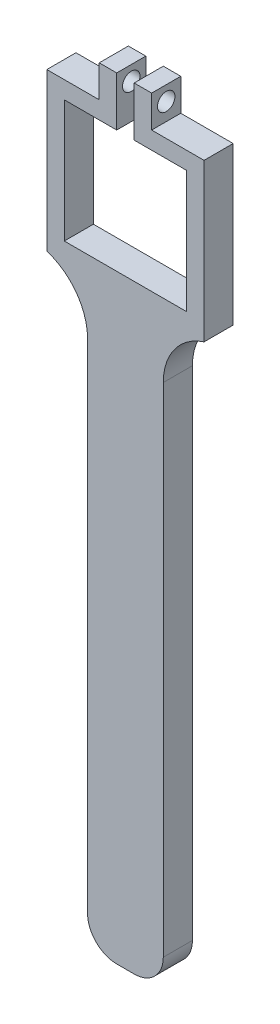
ISO-10303-21;
HEADER;
FILE_DESCRIPTION(('STEP AP214'),'2;1');
FILE_NAME('part.step','',(''),(''),'','','');
FILE_SCHEMA(('AUTOMOTIVE_DESIGN { 1 0 10303 214 1 1 1 1 }'));
ENDSEC;
DATA;
#1=APPLICATION_CONTEXT('core data for automotive mechanical design processes');
#2=APPLICATION_PROTOCOL_DEFINITION('international standard','automotive_design',2000,#1);
#3=PRODUCT_CONTEXT('',#1,'mechanical');
#4=PRODUCT('Part','Part','',(#3));
#5=PRODUCT_RELATED_PRODUCT_CATEGORY('part','',(#4));
#6=PRODUCT_DEFINITION_FORMATION('','',#4);
#7=PRODUCT_DEFINITION_CONTEXT('part definition',#1,'design');
#8=PRODUCT_DEFINITION('design','',#6,#7);
#9=PRODUCT_DEFINITION_SHAPE('','',#8);
#10=(LENGTH_UNIT() NAMED_UNIT(*) SI_UNIT(.MILLI.,.METRE.));
#11=(NAMED_UNIT(*) PLANE_ANGLE_UNIT() SI_UNIT($,.RADIAN.));
#12=(NAMED_UNIT(*) SI_UNIT($,.STERADIAN.) SOLID_ANGLE_UNIT());
#13=UNCERTAINTY_MEASURE_WITH_UNIT(LENGTH_MEASURE(1.E-05),#10,'distance_accuracy_value','');
#14=(GEOMETRIC_REPRESENTATION_CONTEXT(3) GLOBAL_UNCERTAINTY_ASSIGNED_CONTEXT((#13)) GLOBAL_UNIT_ASSIGNED_CONTEXT((#10,
#11,#12)) REPRESENTATION_CONTEXT('',''));
#15=CARTESIAN_POINT('',(0.,0.,0.));
#16=DIRECTION('',(0.,0.,1.));
#17=DIRECTION('',(1.,0.,0.));
#18=AXIS2_PLACEMENT_3D('',#15,#16,#17);
#19=CARTESIAN_POINT('',(-12.3188976377953,15.3425196850394,5.));
#20=DIRECTION('',(-1.,0.,0.));
#21=DIRECTION('',(0.,-1.,0.));
#22=AXIS2_PLACEMENT_3D('',#19,#20,#21);
#23=PLANE('',#22);
#24=DIRECTION('',(0.,1.,0.));
#25=VECTOR('',#24,1.);
#26=CARTESIAN_POINT('',(-12.3188976377953,15.3425196850394,0.));
#27=LINE('',#26,#25);
#28=CARTESIAN_POINT('',(-12.3188976377953,-5.65748031496064,0.));
#29=VERTEX_POINT('',#28);
#30=CARTESIAN_POINT('',(-12.3188976377953,15.3425196850394,0.));
#31=VERTEX_POINT('',#30);
#32=EDGE_CURVE('E209',#29,#31,#27,.T.);
#33=ORIENTED_EDGE('',*,*,#32,.T.);
#34=DIRECTION('',(0.,0.,-1.));
#35=VECTOR('',#34,1.);
#36=CARTESIAN_POINT('',(-12.3188976377953,15.3425196850394,5.));
#37=LINE('',#36,#35);
#38=CARTESIAN_POINT('',(-12.3188976377953,15.3425196850394,5.));
#39=VERTEX_POINT('',#38);
#40=EDGE_CURVE('E190',#39,#31,#37,.T.);
#41=ORIENTED_EDGE('',*,*,#40,.F.);
#42=DIRECTION('',(0.,1.,0.));
#43=VECTOR('',#42,1.);
#44=CARTESIAN_POINT('',(-12.3188976377953,15.3425196850394,5.));
#45=LINE('',#44,#43);
#46=CARTESIAN_POINT('',(-12.3188976377953,-5.65748031496064,5.));
#47=VERTEX_POINT('',#46);
#48=EDGE_CURVE('E197',#47,#39,#45,.T.);
#49=ORIENTED_EDGE('',*,*,#48,.F.);
#50=DIRECTION('',(0.,0.,-1.));
#51=VECTOR('',#50,1.);
#52=CARTESIAN_POINT('',(-12.3188976377953,-5.65748031496064,5.));
#53=LINE('',#52,#51);
#54=EDGE_CURVE('E287',#47,#29,#53,.T.);
#55=ORIENTED_EDGE('',*,*,#54,.T.);
#56=EDGE_LOOP('',(#33,#41,#49,#55));
#57=FACE_BOUND('',#56,.T.);
#58=ADVANCED_FACE('F33',(#57),#23,.F.);
#59=CARTESIAN_POINT('',(-12.3188976377953,15.3425196850394,5.));
#60=DIRECTION('',(0.,1.,0.));
#61=DIRECTION('',(0.,0.,1.));
#62=AXIS2_PLACEMENT_3D('',#59,#60,#61);
#63=PLANE('',#62);
#64=DIRECTION('',(1.,0.,0.));
#65=VECTOR('',#64,1.);
#66=CARTESIAN_POINT('',(-12.3188976377953,15.3425196850394,0.));
#67=LINE('',#66,#65);
#68=CARTESIAN_POINT('',(-3.31889763779529,15.3425196850394,0.));
#69=VERTEX_POINT('',#68);
#70=EDGE_CURVE('E341',#31,#69,#67,.T.);
#71=ORIENTED_EDGE('',*,*,#70,.T.);
#72=DIRECTION('',(0.,0.,-1.));
#73=VECTOR('',#72,1.);
#74=CARTESIAN_POINT('',(-3.31889763779529,15.3425196850394,5.));
#75=LINE('',#74,#73);
#76=CARTESIAN_POINT('',(-3.31889763779529,15.3425196850394,5.));
#77=VERTEX_POINT('',#76);
#78=EDGE_CURVE('E193',#77,#69,#75,.T.);
#79=ORIENTED_EDGE('',*,*,#78,.F.);
#80=DIRECTION('',(1.,0.,0.));
#81=VECTOR('',#80,1.);
#82=CARTESIAN_POINT('',(-12.3188976377953,15.3425196850394,5.));
#83=LINE('',#82,#81);
#84=EDGE_CURVE('E185',#39,#77,#83,.T.);
#85=ORIENTED_EDGE('',*,*,#84,.F.);
#86=ORIENTED_EDGE('',*,*,#40,.T.);
#87=EDGE_LOOP('',(#71,#79,#85,#86));
#88=FACE_BOUND('',#87,.T.);
#89=ADVANCED_FACE('F188',(#88),#63,.F.);
#90=CARTESIAN_POINT('',(-3.31889763779529,23.8425196850394,5.));
#91=DIRECTION('',(-1.,0.,0.));
#92=DIRECTION('',(0.,-1.,0.));
#93=AXIS2_PLACEMENT_3D('',#90,#91,#92);
#94=PLANE('',#93);
#95=CARTESIAN_POINT('',(-3.31889763779529,21.3425196850394,2.5));
#96=DIRECTION('',(-1.,0.,0.));
#97=DIRECTION('',(0.,-1.,0.));
#98=AXIS2_PLACEMENT_3D('',#95,#96,#97);
#99=CIRCLE('',#98,1.5);
#100=CARTESIAN_POINT('',(-3.31889763779529,19.8425196850394,2.5));
#101=VERTEX_POINT('',#100);
#102=EDGE_CURVE('E381',#101,#101,#99,.T.);
#103=ORIENTED_EDGE('',*,*,#102,.T.);
#104=EDGE_LOOP('',(#103));
#105=FACE_BOUND('',#104,.T.);
#106=DIRECTION('',(0.,1.,0.));
#107=VECTOR('',#106,1.);
#108=CARTESIAN_POINT('',(-3.31889763779529,23.8425196850394,0.));
#109=LINE('',#108,#107);
#110=CARTESIAN_POINT('',(-3.31889763779529,23.8425196850394,0.));
#111=VERTEX_POINT('',#110);
#112=EDGE_CURVE('E335',#69,#111,#109,.T.);
#113=ORIENTED_EDGE('',*,*,#112,.T.);
#114=DIRECTION('',(0.,0.,-1.));
#115=VECTOR('',#114,1.);
#116=CARTESIAN_POINT('',(-3.31889763779529,23.8425196850394,5.));
#117=LINE('',#116,#115);
#118=CARTESIAN_POINT('',(-3.31889763779529,23.8425196850394,5.));
#119=VERTEX_POINT('',#118);
#120=EDGE_CURVE('E215',#119,#111,#117,.T.);
#121=ORIENTED_EDGE('',*,*,#120,.F.);
#122=DIRECTION('',(0.,1.,0.));
#123=VECTOR('',#122,1.);
#124=CARTESIAN_POINT('',(-3.31889763779529,18.3425196850394,5.));
#125=LINE('',#124,#123);
#126=EDGE_CURVE('E196',#77,#119,#125,.T.);
#127=ORIENTED_EDGE('',*,*,#126,.F.);
#128=ORIENTED_EDGE('',*,*,#78,.T.);
#129=EDGE_LOOP('',(#113,#121,#127,#128));
#130=FACE_BOUND('',#129,.T.);
#131=ADVANCED_FACE('F382',(#105,#130),#94,.F.);
#132=CARTESIAN_POINT('',(-6.31889763779529,23.8425196850394,5.));
#133=DIRECTION('',(0.,-1.,0.));
#134=DIRECTION('',(0.,0.,-1.));
#135=AXIS2_PLACEMENT_3D('',#132,#133,#134);
#136=PLANE('',#135);
#137=DIRECTION('',(-1.,0.,0.));
#138=VECTOR('',#137,1.);
#139=CARTESIAN_POINT('',(-6.31889763779529,23.8425196850394,0.));
#140=LINE('',#139,#138);
#141=CARTESIAN_POINT('',(-6.31889763779529,23.8425196850394,0.));
#142=VERTEX_POINT('',#141);
#143=EDGE_CURVE('E331',#111,#142,#140,.T.);
#144=ORIENTED_EDGE('',*,*,#143,.T.);
#145=DIRECTION('',(0.,0.,-1.));
#146=VECTOR('',#145,1.);
#147=CARTESIAN_POINT('',(-6.31889763779529,23.8425196850394,5.));
#148=LINE('',#147,#146);
#149=CARTESIAN_POINT('',(-6.31889763779529,23.8425196850394,5.));
#150=VERTEX_POINT('',#149);
#151=EDGE_CURVE('E322',#150,#142,#148,.T.);
#152=ORIENTED_EDGE('',*,*,#151,.F.);
#153=DIRECTION('',(-1.,0.,0.));
#154=VECTOR('',#153,1.);
#155=CARTESIAN_POINT('',(-6.31889763779529,23.8425196850394,5.));
#156=LINE('',#155,#154);
#157=EDGE_CURVE('E332',#119,#150,#156,.T.);
#158=ORIENTED_EDGE('',*,*,#157,.F.);
#159=ORIENTED_EDGE('',*,*,#120,.T.);
#160=EDGE_LOOP('',(#144,#152,#158,#159));
#161=FACE_BOUND('',#160,.T.);
#162=ADVANCED_FACE('F329',(#161),#136,.F.);
#163=CARTESIAN_POINT('',(-6.31889763779529,23.8425196850394,5.));
#164=DIRECTION('',(1.,0.,0.));
#165=DIRECTION('',(0.,1.,0.));
#166=AXIS2_PLACEMENT_3D('',#163,#164,#165);
#167=PLANE('',#166);
#168=CARTESIAN_POINT('',(-6.31889763779528,21.3425196850394,2.5));
#169=DIRECTION('',(-1.,0.,0.));
#170=DIRECTION('',(0.,0.,1.));
#171=AXIS2_PLACEMENT_3D('',#168,#169,#170);
#172=CIRCLE('',#171,1.5);
#173=CARTESIAN_POINT('',(-6.31889763779528,21.3425196850394,4.));
#174=VERTEX_POINT('',#173);
#175=EDGE_CURVE('E641',#174,#174,#172,.T.);
#176=ORIENTED_EDGE('',*,*,#175,.F.);
#177=EDGE_LOOP('',(#176));
#178=FACE_BOUND('',#177,.T.);
#179=DIRECTION('',(0.,-1.,0.));
#180=VECTOR('',#179,1.);
#181=CARTESIAN_POINT('',(-6.31889763779529,23.8425196850394,0.));
#182=LINE('',#181,#180);
#183=CARTESIAN_POINT('',(-6.31889763779529,18.3425196850394,0.));
#184=VERTEX_POINT('',#183);
#185=EDGE_CURVE('E337',#142,#184,#182,.T.);
#186=ORIENTED_EDGE('',*,*,#185,.T.);
#187=DIRECTION('',(0.,0.,-1.));
#188=VECTOR('',#187,1.);
#189=CARTESIAN_POINT('',(-6.31889763779529,18.3425196850394,5.));
#190=LINE('',#189,#188);
#191=CARTESIAN_POINT('',(-6.31889763779529,18.3425196850394,5.));
#192=VERTEX_POINT('',#191);
#193=EDGE_CURVE('E319',#192,#184,#190,.T.);
#194=ORIENTED_EDGE('',*,*,#193,.F.);
#195=DIRECTION('',(0.,-1.,0.));
#196=VECTOR('',#195,1.);
#197=CARTESIAN_POINT('',(-6.31889763779529,23.8425196850394,5.));
#198=LINE('',#197,#196);
#199=EDGE_CURVE('E384',#150,#192,#198,.T.);
#200=ORIENTED_EDGE('',*,*,#199,.F.);
#201=ORIENTED_EDGE('',*,*,#151,.T.);
#202=EDGE_LOOP('',(#186,#194,#200,#201));
#203=FACE_BOUND('',#202,.T.);
#204=ADVANCED_FACE('F393',(#178,#203),#167,.F.);
#205=CARTESIAN_POINT('',(-15.3188976377953,18.3425196850394,5.));
#206=DIRECTION('',(0.,-1.,0.));
#207=DIRECTION('',(0.,0.,-1.));
#208=AXIS2_PLACEMENT_3D('',#205,#206,#207);
#209=PLANE('',#208);
#210=DIRECTION('',(-1.,0.,0.));
#211=VECTOR('',#210,1.);
#212=CARTESIAN_POINT('',(-15.3188976377953,18.3425196850394,0.));
#213=LINE('',#212,#211);
#214=CARTESIAN_POINT('',(-15.3188976377953,18.3425196850394,0.));
#215=VERTEX_POINT('',#214);
#216=EDGE_CURVE('E339',#184,#215,#213,.T.);
#217=ORIENTED_EDGE('',*,*,#216,.T.);
#218=DIRECTION('',(0.,0.,-1.));
#219=VECTOR('',#218,1.);
#220=CARTESIAN_POINT('',(-15.3188976377953,18.3425196850394,5.));
#221=LINE('',#220,#219);
#222=CARTESIAN_POINT('',(-15.3188976377953,18.3425196850394,5.));
#223=VERTEX_POINT('',#222);
#224=EDGE_CURVE('E316',#223,#215,#221,.T.);
#225=ORIENTED_EDGE('',*,*,#224,.F.);
#226=DIRECTION('',(-1.,0.,0.));
#227=VECTOR('',#226,1.);
#228=CARTESIAN_POINT('',(-15.3188976377953,18.3425196850394,5.));
#229=LINE('',#228,#227);
#230=EDGE_CURVE('E363',#192,#223,#229,.T.);
#231=ORIENTED_EDGE('',*,*,#230,.F.);
#232=ORIENTED_EDGE('',*,*,#193,.T.);
#233=EDGE_LOOP('',(#217,#225,#231,#232));
#234=FACE_BOUND('',#233,.T.);
#235=ADVANCED_FACE('F391',(#234),#209,.F.);
#236=CARTESIAN_POINT('',(-15.3188976377953,18.3425196850394,5.));
#237=DIRECTION('',(1.,0.,0.));
#238=DIRECTION('',(0.,1.,0.));
#239=AXIS2_PLACEMENT_3D('',#236,#237,#238);
#240=PLANE('',#239);
#241=DIRECTION('',(0.,-1.,0.));
#242=VECTOR('',#241,1.);
#243=CARTESIAN_POINT('',(-15.3188976377953,18.3425196850394,0.));
#244=LINE('',#243,#242);
#245=CARTESIAN_POINT('',(-15.3188976377953,-8.65748031496064,0.));
#246=VERTEX_POINT('',#245);
#247=EDGE_CURVE('E268',#215,#246,#244,.T.);
#248=ORIENTED_EDGE('',*,*,#247,.T.);
#249=DIRECTION('',(0.,0.,-1.));
#250=VECTOR('',#249,1.);
#251=CARTESIAN_POINT('',(-15.3188976377953,-8.65748031496064,5.));
#252=LINE('',#251,#250);
#253=CARTESIAN_POINT('',(-15.3188976377953,-8.65748031496064,5.));
#254=VERTEX_POINT('',#253);
#255=EDGE_CURVE('E313',#254,#246,#252,.T.);
#256=ORIENTED_EDGE('',*,*,#255,.F.);
#257=DIRECTION('',(0.,-1.,0.));
#258=VECTOR('',#257,1.);
#259=CARTESIAN_POINT('',(-15.3188976377953,18.3425196850394,5.));
#260=LINE('',#259,#258);
#261=EDGE_CURVE('E358',#223,#254,#260,.T.);
#262=ORIENTED_EDGE('',*,*,#261,.F.);
#263=ORIENTED_EDGE('',*,*,#224,.T.);
#264=EDGE_LOOP('',(#248,#256,#262,#263));
#265=FACE_BOUND('',#264,.T.);
#266=ADVANCED_FACE('F349',(#265),#240,.F.);
#267=CARTESIAN_POINT('',(-8.31889763779528,-8.65748031496064,5.));
#268=DIRECTION('',(1.,0.,0.));
#269=DIRECTION('',(0.,1.,0.));
#270=AXIS2_PLACEMENT_3D('',#267,#268,#269);
#271=PLANE('',#270);
#272=DIRECTION('',(0.,-1.,0.));
#273=VECTOR('',#272,1.);
#274=CARTESIAN_POINT('',(-8.31889763779528,-8.65748031496064,0.));
#275=LINE('',#274,#273);
#276=CARTESIAN_POINT('',(-8.31889763779528,-18.1968723291301,0.));
#277=VERTEX_POINT('',#276);
#278=CARTESIAN_POINT('',(-8.31889763779527,-103.657480314961,0.));
#279=VERTEX_POINT('',#278);
#280=EDGE_CURVE('E264',#277,#279,#275,.T.);
#281=ORIENTED_EDGE('',*,*,#280,.T.);
#282=DIRECTION('',(0.,0.,-1.));
#283=VECTOR('',#282,1.);
#284=CARTESIAN_POINT('',(-8.31889763779527,-103.657480314961,5.));
#285=LINE('',#284,#283);
#286=CARTESIAN_POINT('',(-8.31889763779527,-103.657480314961,5.));
#287=VERTEX_POINT('',#286);
#288=EDGE_CURVE('E11',#279,#287,#285,.F.);
#289=ORIENTED_EDGE('',*,*,#288,.T.);
#290=DIRECTION('',(0.,-1.,0.));
#291=VECTOR('',#290,1.);
#292=CARTESIAN_POINT('',(-8.31889763779528,-8.65748031496064,5.));
#293=LINE('',#292,#291);
#294=CARTESIAN_POINT('',(-8.31889763779528,-18.1968723291301,5.));
#295=VERTEX_POINT('',#294);
#296=EDGE_CURVE('E356',#295,#287,#293,.T.);
#297=ORIENTED_EDGE('',*,*,#296,.F.);
#298=DIRECTION('',(0.,0.,-1.));
#299=VECTOR('',#298,1.);
#300=CARTESIAN_POINT('',(-8.31889763779528,-18.1968723291301,5.));
#301=LINE('',#300,#299);
#302=EDGE_CURVE('E210',#295,#277,#301,.T.);
#303=ORIENTED_EDGE('',*,*,#302,.T.);
#304=EDGE_LOOP('',(#281,#289,#297,#303));
#305=FACE_BOUND('',#304,.T.);
#306=ADVANCED_FACE('F359',(#305),#271,.F.);
#307=CARTESIAN_POINT('',(-8.31889763779527,-108.657480314961,5.));
#308=DIRECTION('',(0.,1.,0.));
#309=DIRECTION('',(0.,0.,1.));
#310=AXIS2_PLACEMENT_3D('',#307,#308,#309);
#311=PLANE('',#310);
#312=DIRECTION('',(1.,0.,0.));
#313=VECTOR('',#312,1.);
#314=CARTESIAN_POINT('',(-8.31889763779527,-108.657480314961,0.));
#315=LINE('',#314,#313);
#316=CARTESIAN_POINT('',(-3.31889763779527,-108.657480314961,0.));
#317=VERTEX_POINT('',#316);
#318=CARTESIAN_POINT('',(-0.31889763779527,-108.657480314961,0.));
#319=VERTEX_POINT('',#318);
#320=EDGE_CURVE('E260',#317,#319,#315,.T.);
#321=ORIENTED_EDGE('',*,*,#320,.T.);
#322=DIRECTION('',(0.,0.,-1.));
#323=VECTOR('',#322,1.);
#324=CARTESIAN_POINT('',(-0.31889763779527,-108.657480314961,5.));
#325=LINE('',#324,#323);
#326=CARTESIAN_POINT('',(-0.31889763779527,-108.657480314961,5.));
#327=VERTEX_POINT('',#326);
#328=EDGE_CURVE('E55',#319,#327,#325,.F.);
#329=ORIENTED_EDGE('',*,*,#328,.T.);
#330=DIRECTION('',(1.,0.,0.));
#331=VECTOR('',#330,1.);
#332=CARTESIAN_POINT('',(-8.31889763779527,-108.657480314961,5.));
#333=LINE('',#332,#331);
#334=CARTESIAN_POINT('',(-3.31889763779527,-108.657480314961,5.));
#335=VERTEX_POINT('',#334);
#336=EDGE_CURVE('E246',#335,#327,#333,.T.);
#337=ORIENTED_EDGE('',*,*,#336,.F.);
#338=DIRECTION('',(0.,0.,-1.));
#339=VECTOR('',#338,1.);
#340=CARTESIAN_POINT('',(-3.31889763779527,-108.657480314961,5.));
#341=LINE('',#340,#339);
#342=EDGE_CURVE('E237',#335,#317,#341,.T.);
#343=ORIENTED_EDGE('',*,*,#342,.T.);
#344=EDGE_LOOP('',(#321,#329,#337,#343));
#345=FACE_BOUND('',#344,.T.);
#346=ADVANCED_FACE('F262',(#345),#311,.F.);
#347=CARTESIAN_POINT('',(4.68110236220472,-8.65748031496064,5.));
#348=DIRECTION('',(-1.,0.,0.));
#349=DIRECTION('',(0.,-1.,0.));
#350=AXIS2_PLACEMENT_3D('',#347,#348,#349);
#351=PLANE('',#350);
#352=DIRECTION('',(0.,1.,0.));
#353=VECTOR('',#352,1.);
#354=CARTESIAN_POINT('',(4.68110236220472,-8.65748031496064,5.));
#355=LINE('',#354,#353);
#356=CARTESIAN_POINT('',(4.68110236220473,-103.657480314961,5.));
#357=VERTEX_POINT('',#356);
#358=CARTESIAN_POINT('',(4.68110236220472,-18.1968723291301,5.));
#359=VERTEX_POINT('',#358);
#360=EDGE_CURVE('E245',#357,#359,#355,.T.);
#361=ORIENTED_EDGE('',*,*,#360,.F.);
#362=DIRECTION('',(0.,0.,-1.));
#363=VECTOR('',#362,1.);
#364=CARTESIAN_POINT('',(4.68110236220473,-103.657480314961,5.));
#365=LINE('',#364,#363);
#366=CARTESIAN_POINT('',(4.68110236220473,-103.657480314961,0.));
#367=VERTEX_POINT('',#366);
#368=EDGE_CURVE('E230',#357,#367,#365,.T.);
#369=ORIENTED_EDGE('',*,*,#368,.T.);
#370=DIRECTION('',(0.,1.,0.));
#371=VECTOR('',#370,1.);
#372=CARTESIAN_POINT('',(4.68110236220472,-8.65748031496064,0.));
#373=LINE('',#372,#371);
#374=CARTESIAN_POINT('',(4.68110236220472,-18.1968723291301,0.));
#375=VERTEX_POINT('',#374);
#376=EDGE_CURVE('E261',#367,#375,#373,.T.);
#377=ORIENTED_EDGE('',*,*,#376,.T.);
#378=DIRECTION('',(0.,0.,1.));
#379=VECTOR('',#378,1.);
#380=CARTESIAN_POINT('',(4.68110236220472,-18.1968723291301,5.));
#381=LINE('',#380,#379);
#382=EDGE_CURVE('E213',#375,#359,#381,.T.);
#383=ORIENTED_EDGE('',*,*,#382,.T.);
#384=EDGE_LOOP('',(#361,#369,#377,#383));
#385=FACE_BOUND('',#384,.T.);
#386=ADVANCED_FACE('F250',(#385),#351,.F.);
#387=CARTESIAN_POINT('',(11.6811023622047,18.3425196850394,5.));
#388=DIRECTION('',(-1.,0.,0.));
#389=DIRECTION('',(0.,-1.,0.));
#390=AXIS2_PLACEMENT_3D('',#387,#388,#389);
#391=PLANE('',#390);
#392=DIRECTION('',(0.,1.,0.));
#393=VECTOR('',#392,1.);
#394=CARTESIAN_POINT('',(11.6811023622047,18.3425196850394,0.));
#395=LINE('',#394,#393);
#396=CARTESIAN_POINT('',(11.6811023622047,-8.65748031496064,0.));
#397=VERTEX_POINT('',#396);
#398=CARTESIAN_POINT('',(11.6811023622047,18.3425196850394,0.));
#399=VERTEX_POINT('',#398);
#400=EDGE_CURVE('E266',#397,#399,#395,.T.);
#401=ORIENTED_EDGE('',*,*,#400,.T.);
#402=DIRECTION('',(0.,0.,-1.));
#403=VECTOR('',#402,1.);
#404=CARTESIAN_POINT('',(11.6811023622047,18.3425196850394,5.));
#405=LINE('',#404,#403);
#406=CARTESIAN_POINT('',(11.6811023622047,18.3425196850394,5.));
#407=VERTEX_POINT('',#406);
#408=EDGE_CURVE('E307',#407,#399,#405,.T.);
#409=ORIENTED_EDGE('',*,*,#408,.F.);
#410=DIRECTION('',(0.,1.,0.));
#411=VECTOR('',#410,1.);
#412=CARTESIAN_POINT('',(11.6811023622047,18.3425196850394,5.));
#413=LINE('',#412,#411);
#414=CARTESIAN_POINT('',(11.6811023622047,-8.65748031496064,5.));
#415=VERTEX_POINT('',#414);
#416=EDGE_CURVE('E254',#415,#407,#413,.T.);
#417=ORIENTED_EDGE('',*,*,#416,.F.);
#418=DIRECTION('',(0.,0.,-1.));
#419=VECTOR('',#418,1.);
#420=CARTESIAN_POINT('',(11.6811023622047,-8.65748031496064,5.));
#421=LINE('',#420,#419);
#422=EDGE_CURVE('E310',#415,#397,#421,.T.);
#423=ORIENTED_EDGE('',*,*,#422,.T.);
#424=EDGE_LOOP('',(#401,#409,#417,#423));
#425=FACE_BOUND('',#424,.T.);
#426=ADVANCED_FACE('F467',(#425),#391,.F.);
#427=CARTESIAN_POINT('',(2.68110236220471,18.3425196850394,5.));
#428=DIRECTION('',(0.,-1.,0.));
#429=DIRECTION('',(0.,0.,-1.));
#430=AXIS2_PLACEMENT_3D('',#427,#428,#429);
#431=PLANE('',#430);
#432=DIRECTION('',(-1.,0.,0.));
#433=VECTOR('',#432,1.);
#434=CARTESIAN_POINT('',(2.68110236220471,18.3425196850394,0.));
#435=LINE('',#434,#433);
#436=CARTESIAN_POINT('',(2.68110236220471,18.3425196850394,0.));
#437=VERTEX_POINT('',#436);
#438=EDGE_CURVE('E273',#399,#437,#435,.T.);
#439=ORIENTED_EDGE('',*,*,#438,.T.);
#440=DIRECTION('',(0.,0.,-1.));
#441=VECTOR('',#440,1.);
#442=CARTESIAN_POINT('',(2.68110236220471,18.3425196850394,5.));
#443=LINE('',#442,#441);
#444=CARTESIAN_POINT('',(2.68110236220471,18.3425196850394,5.));
#445=VERTEX_POINT('',#444);
#446=EDGE_CURVE('E304',#445,#437,#443,.T.);
#447=ORIENTED_EDGE('',*,*,#446,.F.);
#448=DIRECTION('',(-1.,0.,0.));
#449=VECTOR('',#448,1.);
#450=CARTESIAN_POINT('',(2.68110236220471,18.3425196850394,5.));
#451=LINE('',#450,#449);
#452=EDGE_CURVE('E368',#407,#445,#451,.T.);
#453=ORIENTED_EDGE('',*,*,#452,.F.);
#454=ORIENTED_EDGE('',*,*,#408,.T.);
#455=EDGE_LOOP('',(#439,#447,#453,#454));
#456=FACE_BOUND('',#455,.T.);
#457=ADVANCED_FACE('F463',(#456),#431,.F.);
#458=CARTESIAN_POINT('',(2.68110236220471,23.8425196850394,5.));
#459=DIRECTION('',(-1.,0.,0.));
#460=DIRECTION('',(0.,-1.,0.));
#461=AXIS2_PLACEMENT_3D('',#458,#459,#460);
#462=PLANE('',#461);
#463=CARTESIAN_POINT('',(2.68110236220471,21.3425196850394,2.5));
#464=DIRECTION('',(-1.,0.,0.));
#465=DIRECTION('',(0.,-1.,0.));
#466=AXIS2_PLACEMENT_3D('',#463,#464,#465);
#467=CIRCLE('',#466,1.5);
#468=CARTESIAN_POINT('',(2.68110236220471,19.8425196850394,2.5));
#469=VERTEX_POINT('',#468);
#470=EDGE_CURVE('E636',#469,#469,#467,.T.);
#471=ORIENTED_EDGE('',*,*,#470,.T.);
#472=EDGE_LOOP('',(#471));
#473=FACE_BOUND('',#472,.T.);
#474=DIRECTION('',(0.,1.,0.));
#475=VECTOR('',#474,1.);
#476=CARTESIAN_POINT('',(2.68110236220471,23.8425196850394,0.));
#477=LINE('',#476,#475);
#478=CARTESIAN_POINT('',(2.68110236220471,23.8425196850394,0.));
#479=VERTEX_POINT('',#478);
#480=EDGE_CURVE('E275',#437,#479,#477,.T.);
#481=ORIENTED_EDGE('',*,*,#480,.T.);
#482=DIRECTION('',(0.,0.,-1.));
#483=VECTOR('',#482,1.);
#484=CARTESIAN_POINT('',(2.68110236220471,23.8425196850394,5.));
#485=LINE('',#484,#483);
#486=CARTESIAN_POINT('',(2.68110236220471,23.8425196850394,5.));
#487=VERTEX_POINT('',#486);
#488=EDGE_CURVE('E301',#487,#479,#485,.T.);
#489=ORIENTED_EDGE('',*,*,#488,.F.);
#490=DIRECTION('',(0.,1.,0.));
#491=VECTOR('',#490,1.);
#492=CARTESIAN_POINT('',(2.68110236220471,23.8425196850394,5.));
#493=LINE('',#492,#491);
#494=EDGE_CURVE('E370',#445,#487,#493,.T.);
#495=ORIENTED_EDGE('',*,*,#494,.F.);
#496=ORIENTED_EDGE('',*,*,#446,.T.);
#497=EDGE_LOOP('',(#481,#489,#495,#496));
#498=FACE_BOUND('',#497,.T.);
#499=ADVANCED_FACE('F459',(#473,#498),#462,.F.);
#500=CARTESIAN_POINT('',(-0.31889763779529,23.8425196850394,5.));
#501=DIRECTION('',(0.,-1.,0.));
#502=DIRECTION('',(0.,0.,-1.));
#503=AXIS2_PLACEMENT_3D('',#500,#501,#502);
#504=PLANE('',#503);
#505=DIRECTION('',(-1.,0.,0.));
#506=VECTOR('',#505,1.);
#507=CARTESIAN_POINT('',(-0.31889763779529,23.8425196850394,0.));
#508=LINE('',#507,#506);
#509=CARTESIAN_POINT('',(-0.31889763779529,23.8425196850394,0.));
#510=VERTEX_POINT('',#509);
#511=EDGE_CURVE('E277',#479,#510,#508,.T.);
#512=ORIENTED_EDGE('',*,*,#511,.T.);
#513=DIRECTION('',(0.,0.,-1.));
#514=VECTOR('',#513,1.);
#515=CARTESIAN_POINT('',(-0.31889763779529,23.8425196850394,5.));
#516=LINE('',#515,#514);
#517=CARTESIAN_POINT('',(-0.31889763779529,23.8425196850394,5.));
#518=VERTEX_POINT('',#517);
#519=EDGE_CURVE('E298',#518,#510,#516,.T.);
#520=ORIENTED_EDGE('',*,*,#519,.F.);
#521=DIRECTION('',(-1.,0.,0.));
#522=VECTOR('',#521,1.);
#523=CARTESIAN_POINT('',(-0.31889763779529,23.8425196850394,5.));
#524=LINE('',#523,#522);
#525=EDGE_CURVE('E372',#487,#518,#524,.T.);
#526=ORIENTED_EDGE('',*,*,#525,.F.);
#527=ORIENTED_EDGE('',*,*,#488,.T.);
#528=EDGE_LOOP('',(#512,#520,#526,#527));
#529=FACE_BOUND('',#528,.T.);
#530=ADVANCED_FACE('F455',(#529),#504,.F.);
#531=CARTESIAN_POINT('',(-0.318897637795287,18.3425196850394,5.));
#532=DIRECTION('',(1.,0.,0.));
#533=DIRECTION('',(0.,1.,0.));
#534=AXIS2_PLACEMENT_3D('',#531,#532,#533);
#535=PLANE('',#534);
#536=CARTESIAN_POINT('',(-0.318897637795286,21.3425196850394,2.5));
#537=DIRECTION('',(1.,0.,0.));
#538=DIRECTION('',(0.,1.,0.));
#539=AXIS2_PLACEMENT_3D('',#536,#537,#538);
#540=CIRCLE('',#539,1.5);
#541=CARTESIAN_POINT('',(-0.318897637795285,22.8425196850394,2.5));
#542=VERTEX_POINT('',#541);
#543=EDGE_CURVE('E37',#542,#542,#540,.T.);
#544=ORIENTED_EDGE('',*,*,#543,.T.);
#545=EDGE_LOOP('',(#544));
#546=FACE_BOUND('',#545,.T.);
#547=DIRECTION('',(0.,-1.,0.));
#548=VECTOR('',#547,1.);
#549=CARTESIAN_POINT('',(-0.318897637795287,18.3425196850394,0.));
#550=LINE('',#549,#548);
#551=CARTESIAN_POINT('',(-0.318897637795289,15.3425196850394,0.));
#552=VERTEX_POINT('',#551);
#553=EDGE_CURVE('E280',#510,#552,#550,.T.);
#554=ORIENTED_EDGE('',*,*,#553,.T.);
#555=DIRECTION('',(0.,0.,-1.));
#556=VECTOR('',#555,1.);
#557=CARTESIAN_POINT('',(-0.318897637795289,15.3425196850394,5.));
#558=LINE('',#557,#556);
#559=CARTESIAN_POINT('',(-0.318897637795289,15.3425196850394,5.));
#560=VERTEX_POINT('',#559);
#561=EDGE_CURVE('E295',#560,#552,#558,.T.);
#562=ORIENTED_EDGE('',*,*,#561,.F.);
#563=DIRECTION('',(0.,-1.,0.));
#564=VECTOR('',#563,1.);
#565=CARTESIAN_POINT('',(-0.31889763779529,23.8425196850394,5.));
#566=LINE('',#565,#564);
#567=EDGE_CURVE('E374',#518,#560,#566,.T.);
#568=ORIENTED_EDGE('',*,*,#567,.F.);
#569=ORIENTED_EDGE('',*,*,#519,.T.);
#570=EDGE_LOOP('',(#554,#562,#568,#569));
#571=FACE_BOUND('',#570,.T.);
#572=ADVANCED_FACE('F451',(#546,#571),#535,.F.);
#573=CARTESIAN_POINT('',(-0.318897637795289,15.3425196850394,5.));
#574=DIRECTION('',(0.,1.,0.));
#575=DIRECTION('',(0.,0.,1.));
#576=AXIS2_PLACEMENT_3D('',#573,#574,#575);
#577=PLANE('',#576);
#578=DIRECTION('',(1.,0.,0.));
#579=VECTOR('',#578,1.);
#580=CARTESIAN_POINT('',(-0.318897637795289,15.3425196850394,0.));
#581=LINE('',#580,#579);
#582=CARTESIAN_POINT('',(8.68110236220472,15.3425196850394,0.));
#583=VERTEX_POINT('',#582);
#584=EDGE_CURVE('E282',#552,#583,#581,.T.);
#585=ORIENTED_EDGE('',*,*,#584,.T.);
#586=DIRECTION('',(0.,0.,-1.));
#587=VECTOR('',#586,1.);
#588=CARTESIAN_POINT('',(8.68110236220472,15.3425196850394,5.));
#589=LINE('',#588,#587);
#590=CARTESIAN_POINT('',(8.68110236220472,15.3425196850394,5.));
#591=VERTEX_POINT('',#590);
#592=EDGE_CURVE('E292',#591,#583,#589,.T.);
#593=ORIENTED_EDGE('',*,*,#592,.F.);
#594=DIRECTION('',(1.,0.,0.));
#595=VECTOR('',#594,1.);
#596=CARTESIAN_POINT('',(-0.318897637795289,15.3425196850394,5.));
#597=LINE('',#596,#595);
#598=EDGE_CURVE('E376',#560,#591,#597,.T.);
#599=ORIENTED_EDGE('',*,*,#598,.F.);
#600=ORIENTED_EDGE('',*,*,#561,.T.);
#601=EDGE_LOOP('',(#585,#593,#599,#600));
#602=FACE_BOUND('',#601,.T.);
#603=ADVANCED_FACE('F447',(#602),#577,.F.);
#604=CARTESIAN_POINT('',(8.68110236220472,15.3425196850394,5.));
#605=DIRECTION('',(1.,0.,0.));
#606=DIRECTION('',(0.,1.,0.));
#607=AXIS2_PLACEMENT_3D('',#604,#605,#606);
#608=PLANE('',#607);
#609=DIRECTION('',(0.,-1.,0.));
#610=VECTOR('',#609,1.);
#611=CARTESIAN_POINT('',(8.68110236220472,15.3425196850394,0.));
#612=LINE('',#611,#610);
#613=CARTESIAN_POINT('',(8.68110236220472,-5.65748031496064,0.));
#614=VERTEX_POINT('',#613);
#615=EDGE_CURVE('E284',#583,#614,#612,.T.);
#616=ORIENTED_EDGE('',*,*,#615,.T.);
#617=DIRECTION('',(0.,0.,-1.));
#618=VECTOR('',#617,1.);
#619=CARTESIAN_POINT('',(8.68110236220472,-5.65748031496064,5.));
#620=LINE('',#619,#618);
#621=CARTESIAN_POINT('',(8.68110236220472,-5.65748031496064,5.));
#622=VERTEX_POINT('',#621);
#623=EDGE_CURVE('E289',#622,#614,#620,.T.);
#624=ORIENTED_EDGE('',*,*,#623,.F.);
#625=DIRECTION('',(0.,-1.,0.));
#626=VECTOR('',#625,1.);
#627=CARTESIAN_POINT('',(8.68110236220472,15.3425196850394,5.));
#628=LINE('',#627,#626);
#629=EDGE_CURVE('E378',#591,#622,#628,.T.);
#630=ORIENTED_EDGE('',*,*,#629,.F.);
#631=ORIENTED_EDGE('',*,*,#592,.T.);
#632=EDGE_LOOP('',(#616,#624,#630,#631));
#633=FACE_BOUND('',#632,.T.);
#634=ADVANCED_FACE('F443',(#633),#608,.F.);
#635=CARTESIAN_POINT('',(-12.3188976377953,-5.65748031496064,5.));
#636=DIRECTION('',(0.,-1.,0.));
#637=DIRECTION('',(1.,0.,0.));
#638=AXIS2_PLACEMENT_3D('',#635,#636,#637);
#639=PLANE('',#638);
#640=DIRECTION('',(-1.,0.,0.));
#641=VECTOR('',#640,1.);
#642=CARTESIAN_POINT('',(-12.3188976377953,-5.65748031496064,0.));
#643=LINE('',#642,#641);
#644=EDGE_CURVE('E206',#614,#29,#643,.T.);
#645=ORIENTED_EDGE('',*,*,#644,.T.);
#646=ORIENTED_EDGE('',*,*,#54,.F.);
#647=DIRECTION('',(-1.,0.,0.));
#648=VECTOR('',#647,1.);
#649=CARTESIAN_POINT('',(-12.3188976377953,-5.65748031496064,5.));
#650=LINE('',#649,#648);
#651=EDGE_CURVE('E202',#622,#47,#650,.T.);
#652=ORIENTED_EDGE('',*,*,#651,.F.);
#653=ORIENTED_EDGE('',*,*,#623,.T.);
#654=EDGE_LOOP('',(#645,#646,#652,#653));
#655=FACE_BOUND('',#654,.T.);
#656=ADVANCED_FACE('F438',(#655),#639,.F.);
#657=CARTESIAN_POINT('',(0.,0.,5.));
#658=DIRECTION('',(0.,0.,1.));
#659=DIRECTION('',(1.,0.,0.));
#660=AXIS2_PLACEMENT_3D('',#657,#658,#659);
#661=PLANE('',#660);
#662=ORIENTED_EDGE('',*,*,#336,.T.);
#663=CARTESIAN_POINT('',(-0.318897637795271,-103.657480314961,5.));
#664=DIRECTION('',(0.,0.,1.));
#665=DIRECTION('',(1.,0.,0.));
#666=AXIS2_PLACEMENT_3D('',#663,#664,#665);
#667=CIRCLE('',#666,5.);
#668=EDGE_CURVE('E42',#327,#357,#667,.T.);
#669=ORIENTED_EDGE('',*,*,#668,.T.);
#670=ORIENTED_EDGE('',*,*,#360,.T.);
#671=CARTESIAN_POINT('',(14.6811023622047,-18.1968723291301,5.));
#672=DIRECTION('',(0.,0.,1.));
#673=DIRECTION('',(1.,0.,0.));
#674=AXIS2_PLACEMENT_3D('',#671,#672,#673);
#675=CIRCLE('',#674,10.);
#676=EDGE_CURVE('E228',#359,#415,#675,.F.);
#677=ORIENTED_EDGE('',*,*,#676,.T.);
#678=ORIENTED_EDGE('',*,*,#416,.T.);
#679=ORIENTED_EDGE('',*,*,#452,.T.);
#680=ORIENTED_EDGE('',*,*,#494,.T.);
#681=ORIENTED_EDGE('',*,*,#525,.T.);
#682=ORIENTED_EDGE('',*,*,#567,.T.);
#683=ORIENTED_EDGE('',*,*,#598,.T.);
#684=ORIENTED_EDGE('',*,*,#629,.T.);
#685=ORIENTED_EDGE('',*,*,#651,.T.);
#686=ORIENTED_EDGE('',*,*,#48,.T.);
#687=ORIENTED_EDGE('',*,*,#84,.T.);
#688=ORIENTED_EDGE('',*,*,#126,.T.);
#689=ORIENTED_EDGE('',*,*,#157,.T.);
#690=ORIENTED_EDGE('',*,*,#199,.T.);
#691=ORIENTED_EDGE('',*,*,#230,.T.);
#692=ORIENTED_EDGE('',*,*,#261,.T.);
#693=CARTESIAN_POINT('',(-18.3188976377953,-18.1968723291301,5.));
#694=DIRECTION('',(0.,0.,1.));
#695=DIRECTION('',(1.,0.,0.));
#696=AXIS2_PLACEMENT_3D('',#693,#694,#695);
#697=CIRCLE('',#696,10.);
#698=EDGE_CURVE('E223',#254,#295,#697,.F.);
#699=ORIENTED_EDGE('',*,*,#698,.T.);
#700=ORIENTED_EDGE('',*,*,#296,.T.);
#701=CARTESIAN_POINT('',(-3.31889763779527,-103.657480314961,5.));
#702=DIRECTION('',(0.,0.,1.));
#703=DIRECTION('',(1.,0.,0.));
#704=AXIS2_PLACEMENT_3D('',#701,#702,#703);
#705=CIRCLE('',#704,5.);
#706=EDGE_CURVE('E241',#287,#335,#705,.T.);
#707=ORIENTED_EDGE('',*,*,#706,.T.);
#708=EDGE_LOOP('',(#662,#669,#670,#677,#678,#679,#680,#681,#682,#683,#684,#685,#686,#687,#688,
#689,#690,#691,#692,#699,#700,#707));
#709=FACE_BOUND('',#708,.T.);
#710=ADVANCED_FACE('F200',(#709),#661,.T.);
#711=CARTESIAN_POINT('',(0.,0.,0.));
#712=DIRECTION('',(0.,0.,1.));
#713=DIRECTION('',(1.,0.,0.));
#714=AXIS2_PLACEMENT_3D('',#711,#712,#713);
#715=PLANE('',#714);
#716=ORIENTED_EDGE('',*,*,#376,.F.);
#717=CARTESIAN_POINT('',(-0.318897637795271,-103.657480314961,0.));
#718=DIRECTION('',(0.,0.,1.));
#719=DIRECTION('',(1.,0.,0.));
#720=AXIS2_PLACEMENT_3D('',#717,#718,#719);
#721=CIRCLE('',#720,5.);
#722=EDGE_CURVE('E235',#367,#319,#721,.F.);
#723=ORIENTED_EDGE('',*,*,#722,.T.);
#724=ORIENTED_EDGE('',*,*,#320,.F.);
#725=CARTESIAN_POINT('',(-3.31889763779527,-103.657480314961,0.));
#726=DIRECTION('',(0.,0.,1.));
#727=DIRECTION('',(1.,0.,0.));
#728=AXIS2_PLACEMENT_3D('',#725,#726,#727);
#729=CIRCLE('',#728,5.);
#730=EDGE_CURVE('E233',#317,#279,#729,.F.);
#731=ORIENTED_EDGE('',*,*,#730,.T.);
#732=ORIENTED_EDGE('',*,*,#280,.F.);
#733=CARTESIAN_POINT('',(-18.3188976377953,-18.1968723291301,0.));
#734=DIRECTION('',(0.,0.,1.));
#735=DIRECTION('',(1.,0.,0.));
#736=AXIS2_PLACEMENT_3D('',#733,#734,#735);
#737=CIRCLE('',#736,10.);
#738=EDGE_CURVE('E221',#277,#246,#737,.T.);
#739=ORIENTED_EDGE('',*,*,#738,.T.);
#740=ORIENTED_EDGE('',*,*,#247,.F.);
#741=ORIENTED_EDGE('',*,*,#216,.F.);
#742=ORIENTED_EDGE('',*,*,#185,.F.);
#743=ORIENTED_EDGE('',*,*,#143,.F.);
#744=ORIENTED_EDGE('',*,*,#112,.F.);
#745=ORIENTED_EDGE('',*,*,#70,.F.);
#746=ORIENTED_EDGE('',*,*,#32,.F.);
#747=ORIENTED_EDGE('',*,*,#644,.F.);
#748=ORIENTED_EDGE('',*,*,#615,.F.);
#749=ORIENTED_EDGE('',*,*,#584,.F.);
#750=ORIENTED_EDGE('',*,*,#553,.F.);
#751=ORIENTED_EDGE('',*,*,#511,.F.);
#752=ORIENTED_EDGE('',*,*,#480,.F.);
#753=ORIENTED_EDGE('',*,*,#438,.F.);
#754=ORIENTED_EDGE('',*,*,#400,.F.);
#755=CARTESIAN_POINT('',(14.6811023622047,-18.1968723291301,0.));
#756=DIRECTION('',(0.,0.,1.));
#757=DIRECTION('',(1.,0.,0.));
#758=AXIS2_PLACEMENT_3D('',#755,#756,#757);
#759=CIRCLE('',#758,10.);
#760=EDGE_CURVE('E225',#397,#375,#759,.T.);
#761=ORIENTED_EDGE('',*,*,#760,.T.);
#762=EDGE_LOOP('',(#716,#723,#724,#731,#732,#739,#740,#741,#742,#743,#744,#745,#746,#747,#748,
#749,#750,#751,#752,#753,#754,#761));
#763=FACE_BOUND('',#762,.T.);
#764=ADVANCED_FACE('F259',(#763),#715,.F.);
#765=CARTESIAN_POINT('',(-18.3188976377953,-18.1968723291301,5.));
#766=DIRECTION('',(0.,0.,-1.));
#767=DIRECTION('',(-1.,0.,0.));
#768=AXIS2_PLACEMENT_3D('',#765,#766,#767);
#769=CYLINDRICAL_SURFACE('',#768,10.);
#770=ORIENTED_EDGE('',*,*,#698,.F.);
#771=ORIENTED_EDGE('',*,*,#255,.T.);
#772=ORIENTED_EDGE('',*,*,#738,.F.);
#773=ORIENTED_EDGE('',*,*,#302,.F.);
#774=EDGE_LOOP('',(#770,#771,#772,#773));
#775=FACE_BOUND('',#774,.T.);
#776=ADVANCED_FACE('F354',(#775),#769,.F.);
#777=CARTESIAN_POINT('',(14.6811023622047,-18.1968723291301,5.));
#778=DIRECTION('',(0.,0.,1.));
#779=DIRECTION('',(1.,0.,0.));
#780=AXIS2_PLACEMENT_3D('',#777,#778,#779);
#781=CYLINDRICAL_SURFACE('',#780,10.);
#782=ORIENTED_EDGE('',*,*,#676,.F.);
#783=ORIENTED_EDGE('',*,*,#382,.F.);
#784=ORIENTED_EDGE('',*,*,#760,.F.);
#785=ORIENTED_EDGE('',*,*,#422,.F.);
#786=EDGE_LOOP('',(#782,#783,#784,#785));
#787=FACE_BOUND('',#786,.T.);
#788=ADVANCED_FACE('F414',(#787),#781,.F.);
#789=CARTESIAN_POINT('',(-0.318897637795271,-103.657480314961,5.));
#790=DIRECTION('',(0.,0.,-1.));
#791=DIRECTION('',(-1.,0.,0.));
#792=AXIS2_PLACEMENT_3D('',#789,#790,#791);
#793=CYLINDRICAL_SURFACE('',#792,5.);
#794=ORIENTED_EDGE('',*,*,#668,.F.);
#795=ORIENTED_EDGE('',*,*,#328,.F.);
#796=ORIENTED_EDGE('',*,*,#722,.F.);
#797=ORIENTED_EDGE('',*,*,#368,.F.);
#798=EDGE_LOOP('',(#794,#795,#796,#797));
#799=FACE_BOUND('',#798,.T.);
#800=ADVANCED_FACE('F256',(#799),#793,.T.);
#801=CARTESIAN_POINT('',(-3.31889763779527,-103.657480314961,5.));
#802=DIRECTION('',(0.,0.,-1.));
#803=DIRECTION('',(-1.,0.,0.));
#804=AXIS2_PLACEMENT_3D('',#801,#802,#803);
#805=CYLINDRICAL_SURFACE('',#804,5.);
#806=ORIENTED_EDGE('',*,*,#706,.F.);
#807=ORIENTED_EDGE('',*,*,#288,.F.);
#808=ORIENTED_EDGE('',*,*,#730,.F.);
#809=ORIENTED_EDGE('',*,*,#342,.F.);
#810=EDGE_LOOP('',(#806,#807,#808,#809));
#811=FACE_BOUND('',#810,.T.);
#812=ADVANCED_FACE('F35',(#811),#805,.T.);
#813=CARTESIAN_POINT('',(8.68110236220472,21.3425196850394,2.5));
#814=DIRECTION('',(-1.,0.,0.));
#815=DIRECTION('',(0.,0.,1.));
#816=AXIS2_PLACEMENT_3D('',#813,#814,#815);
#817=CYLINDRICAL_SURFACE('',#816,1.5);
#818=ORIENTED_EDGE('',*,*,#543,.F.);
#819=EDGE_LOOP('',(#818));
#820=FACE_BOUND('',#819,.T.);
#821=ORIENTED_EDGE('',*,*,#470,.F.);
#822=EDGE_LOOP('',(#821));
#823=FACE_BOUND('',#822,.T.);
#824=ADVANCED_FACE('F421',(#820,#823),#817,.F.);
#825=ORIENTED_EDGE('',*,*,#175,.T.);
#826=EDGE_LOOP('',(#825));
#827=FACE_BOUND('',#826,.T.);
#828=ORIENTED_EDGE('',*,*,#102,.F.);
#829=EDGE_LOOP('',(#828));
#830=FACE_BOUND('',#829,.T.);
#831=ADVANCED_FACE('F426',(#827,#830),#817,.F.);
#832=CLOSED_SHELL('',(#58,#89,#131,#162,#204,#235,#266,#306,#346,#386,#426,#457,#499,#530,#572,
#603,#634,#656,#710,#764,#776,#788,#800,#812,#824,#831));
#833=MANIFOLD_SOLID_BREP('B2',#832);
#834=ADVANCED_BREP_SHAPE_REPRESENTATION('',(#18,#833),#14);
#835=SHAPE_DEFINITION_REPRESENTATION(#9,#834);
ENDSEC;
END-ISO-10303-21;
